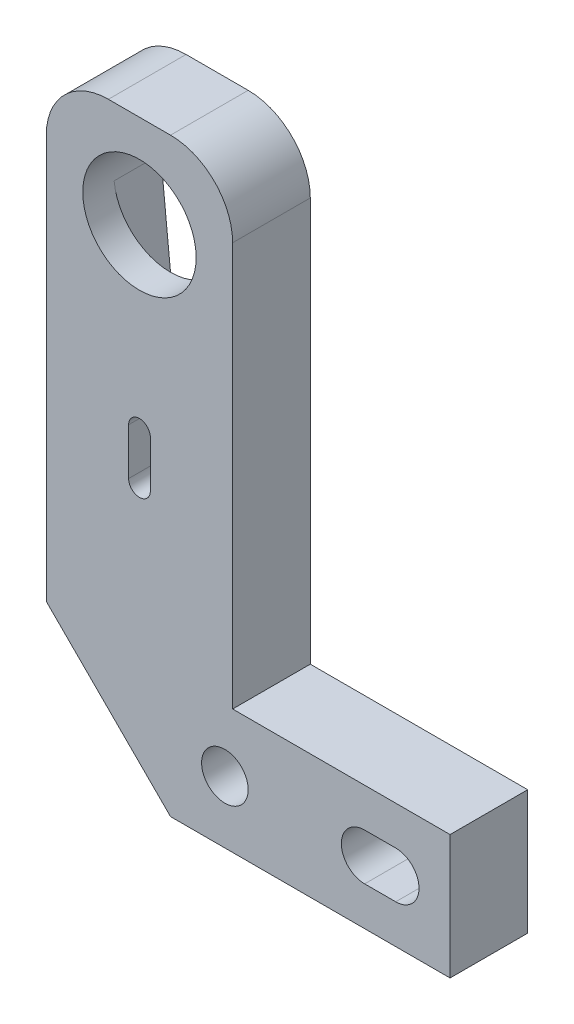
ISO-10303-21;
HEADER;
FILE_DESCRIPTION(('STEP AP214'),'2;1');
FILE_NAME('part.step','',(''),(''),'','','');
FILE_SCHEMA(('AUTOMOTIVE_DESIGN { 1 0 10303 214 1 1 1 1 }'));
ENDSEC;
DATA;
#1=APPLICATION_CONTEXT('core data for automotive mechanical design processes');
#2=APPLICATION_PROTOCOL_DEFINITION('international standard','automotive_design',2000,#1);
#3=PRODUCT_CONTEXT('',#1,'mechanical');
#4=PRODUCT('Part','Part','',(#3));
#5=PRODUCT_RELATED_PRODUCT_CATEGORY('part','',(#4));
#6=PRODUCT_DEFINITION_FORMATION('','',#4);
#7=PRODUCT_DEFINITION_CONTEXT('part definition',#1,'design');
#8=PRODUCT_DEFINITION('design','',#6,#7);
#9=PRODUCT_DEFINITION_SHAPE('','',#8);
#10=(LENGTH_UNIT() NAMED_UNIT(*) SI_UNIT(.MILLI.,.METRE.));
#11=(NAMED_UNIT(*) PLANE_ANGLE_UNIT() SI_UNIT($,.RADIAN.));
#12=(NAMED_UNIT(*) SI_UNIT($,.STERADIAN.) SOLID_ANGLE_UNIT());
#13=UNCERTAINTY_MEASURE_WITH_UNIT(LENGTH_MEASURE(1.E-05),#10,'distance_accuracy_value','');
#14=(GEOMETRIC_REPRESENTATION_CONTEXT(3) GLOBAL_UNCERTAINTY_ASSIGNED_CONTEXT((#13)) GLOBAL_UNIT_ASSIGNED_CONTEXT((#10,
#11,#12)) REPRESENTATION_CONTEXT('',''));
#15=CARTESIAN_POINT('',(0.,0.,0.));
#16=DIRECTION('',(0.,0.,1.));
#17=DIRECTION('',(1.,0.,0.));
#18=AXIS2_PLACEMENT_3D('',#15,#16,#17);
#19=CARTESIAN_POINT('',(0.,0.,5.));
#20=DIRECTION('',(0.,0.,-1.));
#21=DIRECTION('',(-1.,0.,0.));
#22=AXIS2_PLACEMENT_3D('',#19,#20,#21);
#23=CYLINDRICAL_SURFACE('',#22,3.65);
#24=CARTESIAN_POINT('',(0.,0.,5.));
#25=DIRECTION('',(0.,0.,1.));
#26=DIRECTION('',(1.,0.,0.));
#27=AXIS2_PLACEMENT_3D('',#24,#25,#26);
#28=CIRCLE('',#27,3.65);
#29=CARTESIAN_POINT('',(3.65,0.,5.));
#30=VERTEX_POINT('',#29);
#31=EDGE_CURVE('E363',#30,#30,#28,.T.);
#32=ORIENTED_EDGE('',*,*,#31,.T.);
#33=EDGE_LOOP('',(#32));
#34=FACE_BOUND('',#33,.T.);
#35=CARTESIAN_POINT('',(0.,0.,3.));
#36=DIRECTION('',(0.,0.,1.));
#37=DIRECTION('',(1.,0.,0.));
#38=AXIS2_PLACEMENT_3D('',#35,#36,#37);
#39=CIRCLE('',#38,3.65);
#40=CARTESIAN_POINT('',(-3.63170414543916,-0.365000000000001,3.));
#41=VERTEX_POINT('',#40);
#42=CARTESIAN_POINT('',(3.63170414543916,-0.365,3.));
#43=VERTEX_POINT('',#42);
#44=EDGE_CURVE('E389',#41,#43,#39,.T.);
#45=ORIENTED_EDGE('',*,*,#44,.F.);
#46=DIRECTION('',(0.,0.,-1.));
#47=VECTOR('',#46,1.);
#48=CARTESIAN_POINT('',(-3.63170414543916,-0.365000000000001,3.));
#49=LINE('',#48,#47);
#50=CARTESIAN_POINT('',(-3.63170414543916,-0.365000000000001,0.));
#51=VERTEX_POINT('',#50);
#52=EDGE_CURVE('E392',#41,#51,#49,.T.);
#53=ORIENTED_EDGE('',*,*,#52,.T.);
#54=CARTESIAN_POINT('',(0.,0.,0.));
#55=DIRECTION('',(0.,0.,1.));
#56=DIRECTION('',(1.,0.,0.));
#57=AXIS2_PLACEMENT_3D('',#54,#55,#56);
#58=CIRCLE('',#57,3.65);
#59=CARTESIAN_POINT('',(3.63170414543916,-0.365,0.));
#60=VERTEX_POINT('',#59);
#61=EDGE_CURVE('E249',#60,#51,#58,.T.);
#62=ORIENTED_EDGE('',*,*,#61,.F.);
#63=DIRECTION('',(0.,0.,-1.));
#64=VECTOR('',#63,1.);
#65=CARTESIAN_POINT('',(3.63170414543916,-0.365,3.));
#66=LINE('',#65,#64);
#67=EDGE_CURVE('E59',#43,#60,#66,.T.);
#68=ORIENTED_EDGE('',*,*,#67,.F.);
#69=EDGE_LOOP('',(#45,#53,#62,#68));
#70=FACE_BOUND('',#69,.T.);
#71=ADVANCED_FACE('F34',(#34,#70),#23,.F.);
#72=CARTESIAN_POINT('',(0.,0.,0.));
#73=DIRECTION('',(0.,0.,1.));
#74=DIRECTION('',(1.,0.,0.));
#75=AXIS2_PLACEMENT_3D('',#72,#73,#74);
#76=PLANE('',#75);
#77=CARTESIAN_POINT('',(5.5,-28.,0.));
#78=DIRECTION('',(0.,0.,1.));
#79=DIRECTION('',(1.,0.,0.));
#80=AXIS2_PLACEMENT_3D('',#77,#78,#79);
#81=CIRCLE('',#80,1.5);
#82=CARTESIAN_POINT('',(7.,-28.,0.));
#83=VERTEX_POINT('',#82);
#84=EDGE_CURVE('E252',#83,#83,#81,.T.);
#85=ORIENTED_EDGE('',*,*,#84,.T.);
#86=EDGE_LOOP('',(#85));
#87=FACE_BOUND('',#86,.T.);
#88=CARTESIAN_POINT('',(14.5,-28.,0.));
#89=DIRECTION('',(0.,0.,1.));
#90=DIRECTION('',(1.,0.,0.));
#91=AXIS2_PLACEMENT_3D('',#88,#89,#90);
#92=CIRCLE('',#91,1.5);
#93=CARTESIAN_POINT('',(14.5,-26.5,0.));
#94=VERTEX_POINT('',#93);
#95=CARTESIAN_POINT('',(14.5,-29.5,0.));
#96=VERTEX_POINT('',#95);
#97=EDGE_CURVE('E237',#94,#96,#92,.T.);
#98=ORIENTED_EDGE('',*,*,#97,.T.);
#99=DIRECTION('',(1.,0.,0.));
#100=VECTOR('',#99,1.);
#101=CARTESIAN_POINT('',(0.,-29.5,0.));
#102=LINE('',#101,#100);
#103=CARTESIAN_POINT('',(16.5,-29.5,0.));
#104=VERTEX_POINT('',#103);
#105=EDGE_CURVE('E246',#96,#104,#102,.T.);
#106=ORIENTED_EDGE('',*,*,#105,.T.);
#107=CARTESIAN_POINT('',(16.5,-28.,0.));
#108=DIRECTION('',(0.,0.,1.));
#109=DIRECTION('',(1.,0.,0.));
#110=AXIS2_PLACEMENT_3D('',#107,#108,#109);
#111=CIRCLE('',#110,1.5);
#112=CARTESIAN_POINT('',(16.5,-26.5,0.));
#113=VERTEX_POINT('',#112);
#114=EDGE_CURVE('E243',#104,#113,#111,.T.);
#115=ORIENTED_EDGE('',*,*,#114,.T.);
#116=DIRECTION('',(-1.,0.,0.));
#117=VECTOR('',#116,1.);
#118=CARTESIAN_POINT('',(0.,-26.5,0.));
#119=LINE('',#118,#117);
#120=EDGE_CURVE('E240',#113,#94,#119,.T.);
#121=ORIENTED_EDGE('',*,*,#120,.T.);
#122=EDGE_LOOP('',(#98,#106,#115,#121));
#123=FACE_BOUND('',#122,.T.);
#124=CARTESIAN_POINT('',(-2.,2.,0.));
#125=DIRECTION('',(0.,0.,1.));
#126=DIRECTION('',(1.,0.,0.));
#127=AXIS2_PLACEMENT_3D('',#124,#125,#126);
#128=CIRCLE('',#127,4.);
#129=CARTESIAN_POINT('',(-6.,2.,0.));
#130=VERTEX_POINT('',#129);
#131=CARTESIAN_POINT('',(-2.,6.,0.));
#132=VERTEX_POINT('',#131);
#133=EDGE_CURVE('E213',#130,#132,#128,.F.);
#134=ORIENTED_EDGE('',*,*,#133,.T.);
#135=DIRECTION('',(1.,0.,0.));
#136=VECTOR('',#135,1.);
#137=CARTESIAN_POINT('',(0.,6.,0.));
#138=LINE('',#137,#136);
#139=CARTESIAN_POINT('',(2.,6.,0.));
#140=VERTEX_POINT('',#139);
#141=EDGE_CURVE('E234',#132,#140,#138,.T.);
#142=ORIENTED_EDGE('',*,*,#141,.T.);
#143=CARTESIAN_POINT('',(2.,2.,0.));
#144=DIRECTION('',(0.,0.,1.));
#145=DIRECTION('',(1.,0.,0.));
#146=AXIS2_PLACEMENT_3D('',#143,#144,#145);
#147=CIRCLE('',#146,4.);
#148=CARTESIAN_POINT('',(6.,2.,0.));
#149=VERTEX_POINT('',#148);
#150=EDGE_CURVE('E231',#149,#140,#147,.T.);
#151=ORIENTED_EDGE('',*,*,#150,.F.);
#152=DIRECTION('',(0.,-1.,0.));
#153=VECTOR('',#152,1.);
#154=CARTESIAN_POINT('',(6.,0.,0.));
#155=LINE('',#154,#153);
#156=CARTESIAN_POINT('',(6.,-24.,0.));
#157=VERTEX_POINT('',#156);
#158=EDGE_CURVE('E228',#149,#157,#155,.T.);
#159=ORIENTED_EDGE('',*,*,#158,.T.);
#160=DIRECTION('',(-1.,0.,0.));
#161=VECTOR('',#160,1.);
#162=CARTESIAN_POINT('',(0.,-24.,0.));
#163=LINE('',#162,#161);
#164=CARTESIAN_POINT('',(20.,-24.,0.));
#165=VERTEX_POINT('',#164);
#166=EDGE_CURVE('E225',#165,#157,#163,.T.);
#167=ORIENTED_EDGE('',*,*,#166,.F.);
#168=DIRECTION('',(0.,1.,0.));
#169=VECTOR('',#168,1.);
#170=CARTESIAN_POINT('',(20.,0.,0.));
#171=LINE('',#170,#169);
#172=CARTESIAN_POINT('',(20.,-32.,0.));
#173=VERTEX_POINT('',#172);
#174=EDGE_CURVE('E223',#173,#165,#171,.T.);
#175=ORIENTED_EDGE('',*,*,#174,.F.);
#176=DIRECTION('',(1.,0.,0.));
#177=VECTOR('',#176,1.);
#178=CARTESIAN_POINT('',(0.,-32.,0.));
#179=LINE('',#178,#177);
#180=CARTESIAN_POINT('',(2.00000000000001,-32.,0.));
#181=VERTEX_POINT('',#180);
#182=EDGE_CURVE('E221',#181,#173,#179,.T.);
#183=ORIENTED_EDGE('',*,*,#182,.F.);
#184=DIRECTION('',(0.707106781186546,-0.707106781186549,0.));
#185=VECTOR('',#184,1.);
#186=CARTESIAN_POINT('',(-15.,-15.,0.));
#187=LINE('',#186,#185);
#188=CARTESIAN_POINT('',(-6.,-24.,0.));
#189=VERTEX_POINT('',#188);
#190=EDGE_CURVE('E219',#189,#181,#187,.T.);
#191=ORIENTED_EDGE('',*,*,#190,.F.);
#192=DIRECTION('',(0.,-1.,0.));
#193=VECTOR('',#192,1.);
#194=CARTESIAN_POINT('',(-6.,0.,0.));
#195=LINE('',#194,#193);
#196=EDGE_CURVE('E216',#130,#189,#195,.T.);
#197=ORIENTED_EDGE('',*,*,#196,.F.);
#198=EDGE_LOOP('',(#134,#142,#151,#159,#167,#175,#183,#191,#197));
#199=FACE_BOUND('',#198,.T.);
#200=DIRECTION('',(0.1,-0.99498743710662,0.));
#201=VECTOR('',#200,1.);
#202=CARTESIAN_POINT('',(-3.63170414543916,-0.365,0.));
#203=LINE('',#202,#201);
#204=CARTESIAN_POINT('',(-2.23872173348989,-14.225,0.));
#205=VERTEX_POINT('',#204);
#206=EDGE_CURVE('E393',#51,#205,#203,.T.);
#207=ORIENTED_EDGE('',*,*,#206,.T.);
#208=CARTESIAN_POINT('',(0.,-14.,0.));
#209=DIRECTION('',(0.,0.,1.));
#210=DIRECTION('',(1.,0.,0.));
#211=AXIS2_PLACEMENT_3D('',#208,#209,#210);
#212=CIRCLE('',#211,2.25);
#213=CARTESIAN_POINT('',(2.2387217334899,-14.225,0.));
#214=VERTEX_POINT('',#213);
#215=EDGE_CURVE('E396',#205,#214,#212,.T.);
#216=ORIENTED_EDGE('',*,*,#215,.T.);
#217=DIRECTION('',(0.0999999999999999,0.99498743710662,0.));
#218=VECTOR('',#217,1.);
#219=CARTESIAN_POINT('',(3.63170414543916,-0.364999999999999,0.));
#220=LINE('',#219,#218);
#221=EDGE_CURVE('E193',#214,#60,#220,.T.);
#222=ORIENTED_EDGE('',*,*,#221,.T.);
#223=ORIENTED_EDGE('',*,*,#61,.T.);
#224=EDGE_LOOP('',(#207,#216,#222,#223));
#225=FACE_BOUND('',#224,.T.);
#226=ADVANCED_FACE('F300',(#87,#123,#199,#225),#76,.F.);
#227=CARTESIAN_POINT('',(0.,-11.5,5.));
#228=DIRECTION('',(0.,0.,-1.));
#229=DIRECTION('',(-1.,0.,0.));
#230=AXIS2_PLACEMENT_3D('',#227,#228,#229);
#231=CYLINDRICAL_SURFACE('',#230,0.7);
#232=CARTESIAN_POINT('',(0.,-11.5,3.));
#233=DIRECTION('',(0.,0.,1.));
#234=DIRECTION('',(1.,0.,0.));
#235=AXIS2_PLACEMENT_3D('',#232,#233,#234);
#236=CIRCLE('',#235,0.7);
#237=CARTESIAN_POINT('',(0.7,-11.5,3.));
#238=VERTEX_POINT('',#237);
#239=CARTESIAN_POINT('',(-0.7,-11.5,3.));
#240=VERTEX_POINT('',#239);
#241=EDGE_CURVE('E51',#238,#240,#236,.T.);
#242=ORIENTED_EDGE('',*,*,#241,.F.);
#243=DIRECTION('',(0.,0.,-1.));
#244=VECTOR('',#243,1.);
#245=CARTESIAN_POINT('',(0.7,-11.5,5.));
#246=LINE('',#245,#244);
#247=CARTESIAN_POINT('',(0.7,-11.5,5.));
#248=VERTEX_POINT('',#247);
#249=EDGE_CURVE('E11',#248,#238,#246,.T.);
#250=ORIENTED_EDGE('',*,*,#249,.F.);
#251=CARTESIAN_POINT('',(0.,-11.5,5.));
#252=DIRECTION('',(0.,0.,1.));
#253=DIRECTION('',(1.,0.,0.));
#254=AXIS2_PLACEMENT_3D('',#251,#252,#253);
#255=CIRCLE('',#254,0.7);
#256=CARTESIAN_POINT('',(-0.7,-11.5,5.));
#257=VERTEX_POINT('',#256);
#258=EDGE_CURVE('E203',#248,#257,#255,.T.);
#259=ORIENTED_EDGE('',*,*,#258,.T.);
#260=DIRECTION('',(0.,0.,-1.));
#261=VECTOR('',#260,1.);
#262=CARTESIAN_POINT('',(-0.7,-11.5,5.));
#263=LINE('',#262,#261);
#264=EDGE_CURVE('E192',#257,#240,#263,.T.);
#265=ORIENTED_EDGE('',*,*,#264,.T.);
#266=EDGE_LOOP('',(#242,#250,#259,#265));
#267=FACE_BOUND('',#266,.T.);
#268=ADVANCED_FACE('F188',(#267),#231,.F.);
#269=CARTESIAN_POINT('',(0.699999999999998,0.,5.));
#270=DIRECTION('',(-1.,0.,0.));
#271=DIRECTION('',(0.,-1.,0.));
#272=AXIS2_PLACEMENT_3D('',#269,#270,#271);
#273=PLANE('',#272);
#274=DIRECTION('',(0.,1.,0.));
#275=VECTOR('',#274,1.);
#276=CARTESIAN_POINT('',(0.699999999999998,0.,3.));
#277=LINE('',#276,#275);
#278=CARTESIAN_POINT('',(0.700000000000001,-14.5,3.));
#279=VERTEX_POINT('',#278);
#280=EDGE_CURVE('E178',#279,#238,#277,.T.);
#281=ORIENTED_EDGE('',*,*,#280,.F.);
#282=DIRECTION('',(0.,0.,-1.));
#283=VECTOR('',#282,1.);
#284=CARTESIAN_POINT('',(0.700000000000001,-14.5,5.));
#285=LINE('',#284,#283);
#286=CARTESIAN_POINT('',(0.700000000000001,-14.5,5.));
#287=VERTEX_POINT('',#286);
#288=EDGE_CURVE('E43',#287,#279,#285,.T.);
#289=ORIENTED_EDGE('',*,*,#288,.F.);
#290=DIRECTION('',(0.,1.,0.));
#291=VECTOR('',#290,1.);
#292=CARTESIAN_POINT('',(0.699999999999998,0.,5.));
#293=LINE('',#292,#291);
#294=EDGE_CURVE('E198',#287,#248,#293,.T.);
#295=ORIENTED_EDGE('',*,*,#294,.T.);
#296=ORIENTED_EDGE('',*,*,#249,.T.);
#297=EDGE_LOOP('',(#281,#289,#295,#296));
#298=FACE_BOUND('',#297,.T.);
#299=ADVANCED_FACE('F196',(#298),#273,.T.);
#300=CARTESIAN_POINT('',(0.,-14.5,5.));
#301=DIRECTION('',(0.,0.,-1.));
#302=DIRECTION('',(-1.,0.,0.));
#303=AXIS2_PLACEMENT_3D('',#300,#301,#302);
#304=CYLINDRICAL_SURFACE('',#303,0.7);
#305=CARTESIAN_POINT('',(0.,-14.5,3.));
#306=DIRECTION('',(0.,0.,1.));
#307=DIRECTION('',(1.,0.,0.));
#308=AXIS2_PLACEMENT_3D('',#305,#306,#307);
#309=CIRCLE('',#308,0.7);
#310=CARTESIAN_POINT('',(-0.699999999999999,-14.5,3.));
#311=VERTEX_POINT('',#310);
#312=EDGE_CURVE('E182',#311,#279,#309,.T.);
#313=ORIENTED_EDGE('',*,*,#312,.F.);
#314=DIRECTION('',(0.,0.,-1.));
#315=VECTOR('',#314,1.);
#316=CARTESIAN_POINT('',(-0.699999999999999,-14.5,5.));
#317=LINE('',#316,#315);
#318=CARTESIAN_POINT('',(-0.699999999999999,-14.5,5.));
#319=VERTEX_POINT('',#318);
#320=EDGE_CURVE('E257',#319,#311,#317,.T.);
#321=ORIENTED_EDGE('',*,*,#320,.F.);
#322=CARTESIAN_POINT('',(0.,-14.5,5.));
#323=DIRECTION('',(0.,0.,1.));
#324=DIRECTION('',(1.,0.,0.));
#325=AXIS2_PLACEMENT_3D('',#322,#323,#324);
#326=CIRCLE('',#325,0.7);
#327=EDGE_CURVE('E202',#319,#287,#326,.T.);
#328=ORIENTED_EDGE('',*,*,#327,.T.);
#329=ORIENTED_EDGE('',*,*,#288,.T.);
#330=EDGE_LOOP('',(#313,#321,#328,#329));
#331=FACE_BOUND('',#330,.T.);
#332=ADVANCED_FACE('F451',(#331),#304,.F.);
#333=CARTESIAN_POINT('',(14.5,-28.,5.));
#334=DIRECTION('',(0.,0.,-1.));
#335=DIRECTION('',(-1.,0.,0.));
#336=AXIS2_PLACEMENT_3D('',#333,#334,#335);
#337=CYLINDRICAL_SURFACE('',#336,1.5);
#338=ORIENTED_EDGE('',*,*,#97,.F.);
#339=DIRECTION('',(0.,0.,-1.));
#340=VECTOR('',#339,1.);
#341=CARTESIAN_POINT('',(14.5,-26.5,5.));
#342=LINE('',#341,#340);
#343=CARTESIAN_POINT('',(14.5,-26.5,5.));
#344=VERTEX_POINT('',#343);
#345=EDGE_CURVE('E258',#344,#94,#342,.T.);
#346=ORIENTED_EDGE('',*,*,#345,.F.);
#347=CARTESIAN_POINT('',(14.5,-28.,5.));
#348=DIRECTION('',(0.,0.,1.));
#349=DIRECTION('',(1.,0.,0.));
#350=AXIS2_PLACEMENT_3D('',#347,#348,#349);
#351=CIRCLE('',#350,1.5);
#352=CARTESIAN_POINT('',(14.5,-29.5,5.));
#353=VERTEX_POINT('',#352);
#354=EDGE_CURVE('E351',#344,#353,#351,.T.);
#355=ORIENTED_EDGE('',*,*,#354,.T.);
#356=DIRECTION('',(0.,0.,-1.));
#357=VECTOR('',#356,1.);
#358=CARTESIAN_POINT('',(14.5,-29.5,5.));
#359=LINE('',#358,#357);
#360=EDGE_CURVE('E262',#353,#96,#359,.T.);
#361=ORIENTED_EDGE('',*,*,#360,.T.);
#362=EDGE_LOOP('',(#338,#346,#355,#361));
#363=FACE_BOUND('',#362,.T.);
#364=ADVANCED_FACE('F447',(#363),#337,.F.);
#365=CARTESIAN_POINT('',(0.,-26.5,5.));
#366=DIRECTION('',(0.,-1.,0.));
#367=DIRECTION('',(0.,0.,-1.));
#368=AXIS2_PLACEMENT_3D('',#365,#366,#367);
#369=PLANE('',#368);
#370=ORIENTED_EDGE('',*,*,#120,.F.);
#371=DIRECTION('',(0.,0.,-1.));
#372=VECTOR('',#371,1.);
#373=CARTESIAN_POINT('',(16.5,-26.5,5.));
#374=LINE('',#373,#372);
#375=CARTESIAN_POINT('',(16.5,-26.5,5.));
#376=VERTEX_POINT('',#375);
#377=EDGE_CURVE('E266',#376,#113,#374,.T.);
#378=ORIENTED_EDGE('',*,*,#377,.F.);
#379=DIRECTION('',(-1.,0.,0.));
#380=VECTOR('',#379,1.);
#381=CARTESIAN_POINT('',(0.,-26.5,5.));
#382=LINE('',#381,#380);
#383=EDGE_CURVE('E354',#376,#344,#382,.T.);
#384=ORIENTED_EDGE('',*,*,#383,.T.);
#385=ORIENTED_EDGE('',*,*,#345,.T.);
#386=EDGE_LOOP('',(#370,#378,#384,#385));
#387=FACE_BOUND('',#386,.T.);
#388=ADVANCED_FACE('F443',(#387),#369,.T.);
#389=CARTESIAN_POINT('',(16.5,-28.,5.));
#390=DIRECTION('',(0.,0.,-1.));
#391=DIRECTION('',(-1.,0.,0.));
#392=AXIS2_PLACEMENT_3D('',#389,#390,#391);
#393=CYLINDRICAL_SURFACE('',#392,1.5);
#394=ORIENTED_EDGE('',*,*,#114,.F.);
#395=DIRECTION('',(0.,0.,-1.));
#396=VECTOR('',#395,1.);
#397=CARTESIAN_POINT('',(16.5,-29.5,5.));
#398=LINE('',#397,#396);
#399=CARTESIAN_POINT('',(16.5,-29.5,5.));
#400=VERTEX_POINT('',#399);
#401=EDGE_CURVE('E264',#400,#104,#398,.T.);
#402=ORIENTED_EDGE('',*,*,#401,.F.);
#403=CARTESIAN_POINT('',(16.5,-28.,5.));
#404=DIRECTION('',(0.,0.,1.));
#405=DIRECTION('',(1.,0.,0.));
#406=AXIS2_PLACEMENT_3D('',#403,#404,#405);
#407=CIRCLE('',#406,1.5);
#408=EDGE_CURVE('E357',#400,#376,#407,.T.);
#409=ORIENTED_EDGE('',*,*,#408,.T.);
#410=ORIENTED_EDGE('',*,*,#377,.T.);
#411=EDGE_LOOP('',(#394,#402,#409,#410));
#412=FACE_BOUND('',#411,.T.);
#413=ADVANCED_FACE('F440',(#412),#393,.F.);
#414=CARTESIAN_POINT('',(-2.,2.,5.));
#415=DIRECTION('',(0.,0.,-1.));
#416=DIRECTION('',(-1.,0.,0.));
#417=AXIS2_PLACEMENT_3D('',#414,#415,#416);
#418=CYLINDRICAL_SURFACE('',#417,4.);
#419=ORIENTED_EDGE('',*,*,#133,.F.);
#420=DIRECTION('',(0.,0.,-1.));
#421=VECTOR('',#420,1.);
#422=CARTESIAN_POINT('',(-6.,2.,5.));
#423=LINE('',#422,#421);
#424=CARTESIAN_POINT('',(-6.,2.,5.));
#425=VERTEX_POINT('',#424);
#426=EDGE_CURVE('E38',#425,#130,#423,.T.);
#427=ORIENTED_EDGE('',*,*,#426,.F.);
#428=CARTESIAN_POINT('',(-2.,2.,5.));
#429=DIRECTION('',(0.,0.,1.));
#430=DIRECTION('',(1.,0.,0.));
#431=AXIS2_PLACEMENT_3D('',#428,#429,#430);
#432=CIRCLE('',#431,4.);
#433=CARTESIAN_POINT('',(-2.,6.,5.));
#434=VERTEX_POINT('',#433);
#435=EDGE_CURVE('E255',#425,#434,#432,.F.);
#436=ORIENTED_EDGE('',*,*,#435,.T.);
#437=DIRECTION('',(0.,0.,-1.));
#438=VECTOR('',#437,1.);
#439=CARTESIAN_POINT('',(-2.,6.,5.));
#440=LINE('',#439,#438);
#441=EDGE_CURVE('E212',#434,#132,#440,.T.);
#442=ORIENTED_EDGE('',*,*,#441,.T.);
#443=EDGE_LOOP('',(#419,#427,#436,#442));
#444=FACE_BOUND('',#443,.T.);
#445=ADVANCED_FACE('F36',(#444),#418,.T.);
#446=CARTESIAN_POINT('',(-6.,0.,5.));
#447=DIRECTION('',(1.,0.,0.));
#448=DIRECTION('',(0.,1.,0.));
#449=AXIS2_PLACEMENT_3D('',#446,#447,#448);
#450=PLANE('',#449);
#451=ORIENTED_EDGE('',*,*,#196,.T.);
#452=DIRECTION('',(0.,0.,-1.));
#453=VECTOR('',#452,1.);
#454=CARTESIAN_POINT('',(-6.,-24.,5.));
#455=LINE('',#454,#453);
#456=CARTESIAN_POINT('',(-6.,-24.,5.));
#457=VERTEX_POINT('',#456);
#458=EDGE_CURVE('E284',#457,#189,#455,.T.);
#459=ORIENTED_EDGE('',*,*,#458,.F.);
#460=DIRECTION('',(0.,-1.,0.));
#461=VECTOR('',#460,1.);
#462=CARTESIAN_POINT('',(-6.,0.,5.));
#463=LINE('',#462,#461);
#464=EDGE_CURVE('E294',#425,#457,#463,.T.);
#465=ORIENTED_EDGE('',*,*,#464,.F.);
#466=ORIENTED_EDGE('',*,*,#426,.T.);
#467=EDGE_LOOP('',(#451,#459,#465,#466));
#468=FACE_BOUND('',#467,.T.);
#469=ADVANCED_FACE('F293',(#468),#450,.F.);
#470=CARTESIAN_POINT('',(-15.,-15.,5.));
#471=DIRECTION('',(0.707106781186549,0.707106781186546,0.));
#472=DIRECTION('',(-0.707106781186546,0.707106781186549,0.));
#473=AXIS2_PLACEMENT_3D('',#470,#471,#472);
#474=PLANE('',#473);
#475=ORIENTED_EDGE('',*,*,#190,.T.);
#476=DIRECTION('',(0.,0.,-1.));
#477=VECTOR('',#476,1.);
#478=CARTESIAN_POINT('',(2.00000000000001,-32.,5.));
#479=LINE('',#478,#477);
#480=CARTESIAN_POINT('',(2.00000000000001,-32.,5.));
#481=VERTEX_POINT('',#480);
#482=EDGE_CURVE('E282',#481,#181,#479,.T.);
#483=ORIENTED_EDGE('',*,*,#482,.F.);
#484=DIRECTION('',(0.707106781186546,-0.707106781186549,0.));
#485=VECTOR('',#484,1.);
#486=CARTESIAN_POINT('',(-15.,-15.,5.));
#487=LINE('',#486,#485);
#488=EDGE_CURVE('E337',#457,#481,#487,.T.);
#489=ORIENTED_EDGE('',*,*,#488,.F.);
#490=ORIENTED_EDGE('',*,*,#458,.T.);
#491=EDGE_LOOP('',(#475,#483,#489,#490));
#492=FACE_BOUND('',#491,.T.);
#493=ADVANCED_FACE('F336',(#492),#474,.F.);
#494=CARTESIAN_POINT('',(0.,-32.,5.));
#495=DIRECTION('',(0.,1.,0.));
#496=DIRECTION('',(0.,0.,1.));
#497=AXIS2_PLACEMENT_3D('',#494,#495,#496);
#498=PLANE('',#497);
#499=ORIENTED_EDGE('',*,*,#182,.T.);
#500=DIRECTION('',(0.,0.,-1.));
#501=VECTOR('',#500,1.);
#502=CARTESIAN_POINT('',(20.,-32.,5.));
#503=LINE('',#502,#501);
#504=CARTESIAN_POINT('',(20.,-32.,5.));
#505=VERTEX_POINT('',#504);
#506=EDGE_CURVE('E279',#505,#173,#503,.T.);
#507=ORIENTED_EDGE('',*,*,#506,.F.);
#508=DIRECTION('',(1.,0.,0.));
#509=VECTOR('',#508,1.);
#510=CARTESIAN_POINT('',(0.,-32.,5.));
#511=LINE('',#510,#509);
#512=EDGE_CURVE('E334',#481,#505,#511,.T.);
#513=ORIENTED_EDGE('',*,*,#512,.F.);
#514=ORIENTED_EDGE('',*,*,#482,.T.);
#515=EDGE_LOOP('',(#499,#507,#513,#514));
#516=FACE_BOUND('',#515,.T.);
#517=ADVANCED_FACE('F333',(#516),#498,.F.);
#518=CARTESIAN_POINT('',(20.,0.,5.));
#519=DIRECTION('',(-1.,0.,0.));
#520=DIRECTION('',(0.,0.,1.));
#521=AXIS2_PLACEMENT_3D('',#518,#519,#520);
#522=PLANE('',#521);
#523=ORIENTED_EDGE('',*,*,#174,.T.);
#524=DIRECTION('',(0.,0.,-1.));
#525=VECTOR('',#524,1.);
#526=CARTESIAN_POINT('',(20.,-24.,5.));
#527=LINE('',#526,#525);
#528=CARTESIAN_POINT('',(20.,-24.,5.));
#529=VERTEX_POINT('',#528);
#530=EDGE_CURVE('E276',#529,#165,#527,.T.);
#531=ORIENTED_EDGE('',*,*,#530,.F.);
#532=DIRECTION('',(0.,1.,0.));
#533=VECTOR('',#532,1.);
#534=CARTESIAN_POINT('',(20.,0.,5.));
#535=LINE('',#534,#533);
#536=EDGE_CURVE('E330',#505,#529,#535,.T.);
#537=ORIENTED_EDGE('',*,*,#536,.F.);
#538=ORIENTED_EDGE('',*,*,#506,.T.);
#539=EDGE_LOOP('',(#523,#531,#537,#538));
#540=FACE_BOUND('',#539,.T.);
#541=ADVANCED_FACE('F327',(#540),#522,.F.);
#542=CARTESIAN_POINT('',(0.,-24.,5.));
#543=DIRECTION('',(0.,-1.,0.));
#544=DIRECTION('',(1.,0.,0.));
#545=AXIS2_PLACEMENT_3D('',#542,#543,#544);
#546=PLANE('',#545);
#547=ORIENTED_EDGE('',*,*,#166,.T.);
#548=DIRECTION('',(0.,0.,-1.));
#549=VECTOR('',#548,1.);
#550=CARTESIAN_POINT('',(6.,-24.,5.));
#551=LINE('',#550,#549);
#552=CARTESIAN_POINT('',(6.,-24.,5.));
#553=VERTEX_POINT('',#552);
#554=EDGE_CURVE('E274',#553,#157,#551,.T.);
#555=ORIENTED_EDGE('',*,*,#554,.F.);
#556=DIRECTION('',(-1.,0.,0.));
#557=VECTOR('',#556,1.);
#558=CARTESIAN_POINT('',(0.,-24.,5.));
#559=LINE('',#558,#557);
#560=EDGE_CURVE('E345',#529,#553,#559,.T.);
#561=ORIENTED_EDGE('',*,*,#560,.F.);
#562=ORIENTED_EDGE('',*,*,#530,.T.);
#563=EDGE_LOOP('',(#547,#555,#561,#562));
#564=FACE_BOUND('',#563,.T.);
#565=ADVANCED_FACE('F323',(#564),#546,.F.);
#566=CARTESIAN_POINT('',(6.,0.,5.));
#567=DIRECTION('',(1.,0.,0.));
#568=DIRECTION('',(0.,1.,0.));
#569=AXIS2_PLACEMENT_3D('',#566,#567,#568);
#570=PLANE('',#569);
#571=ORIENTED_EDGE('',*,*,#158,.F.);
#572=DIRECTION('',(0.,0.,-1.));
#573=VECTOR('',#572,1.);
#574=CARTESIAN_POINT('',(6.,2.,5.));
#575=LINE('',#574,#573);
#576=CARTESIAN_POINT('',(6.,2.,5.));
#577=VERTEX_POINT('',#576);
#578=EDGE_CURVE('E272',#577,#149,#575,.T.);
#579=ORIENTED_EDGE('',*,*,#578,.F.);
#580=DIRECTION('',(0.,-1.,0.));
#581=VECTOR('',#580,1.);
#582=CARTESIAN_POINT('',(6.,0.,5.));
#583=LINE('',#582,#581);
#584=EDGE_CURVE('E320',#577,#553,#583,.T.);
#585=ORIENTED_EDGE('',*,*,#584,.T.);
#586=ORIENTED_EDGE('',*,*,#554,.T.);
#587=EDGE_LOOP('',(#571,#579,#585,#586));
#588=FACE_BOUND('',#587,.T.);
#589=ADVANCED_FACE('F315',(#588),#570,.T.);
#590=CARTESIAN_POINT('',(2.,2.,5.));
#591=DIRECTION('',(0.,0.,-1.));
#592=DIRECTION('',(-1.,0.,0.));
#593=AXIS2_PLACEMENT_3D('',#590,#591,#592);
#594=CYLINDRICAL_SURFACE('',#593,4.);
#595=ORIENTED_EDGE('',*,*,#150,.T.);
#596=DIRECTION('',(0.,0.,-1.));
#597=VECTOR('',#596,1.);
#598=CARTESIAN_POINT('',(2.,6.,5.));
#599=LINE('',#598,#597);
#600=CARTESIAN_POINT('',(2.,6.,5.));
#601=VERTEX_POINT('',#600);
#602=EDGE_CURVE('E270',#601,#140,#599,.T.);
#603=ORIENTED_EDGE('',*,*,#602,.F.);
#604=CARTESIAN_POINT('',(2.,2.,5.));
#605=DIRECTION('',(0.,0.,1.));
#606=DIRECTION('',(1.,0.,0.));
#607=AXIS2_PLACEMENT_3D('',#604,#605,#606);
#608=CIRCLE('',#607,4.);
#609=EDGE_CURVE('E348',#577,#601,#608,.T.);
#610=ORIENTED_EDGE('',*,*,#609,.F.);
#611=ORIENTED_EDGE('',*,*,#578,.T.);
#612=EDGE_LOOP('',(#595,#603,#610,#611));
#613=FACE_BOUND('',#612,.T.);
#614=ADVANCED_FACE('F455',(#613),#594,.T.);
#615=CARTESIAN_POINT('',(5.5,-28.,5.));
#616=DIRECTION('',(0.,0.,-1.));
#617=DIRECTION('',(-1.,0.,0.));
#618=AXIS2_PLACEMENT_3D('',#615,#616,#617);
#619=CYLINDRICAL_SURFACE('',#618,1.5);
#620=CARTESIAN_POINT('',(5.5,-28.,5.));
#621=DIRECTION('',(0.,0.,1.));
#622=DIRECTION('',(1.,0.,0.));
#623=AXIS2_PLACEMENT_3D('',#620,#621,#622);
#624=CIRCLE('',#623,1.5);
#625=CARTESIAN_POINT('',(7.,-28.,5.));
#626=VERTEX_POINT('',#625);
#627=EDGE_CURVE('E207',#626,#626,#624,.T.);
#628=ORIENTED_EDGE('',*,*,#627,.T.);
#629=EDGE_LOOP('',(#628));
#630=FACE_BOUND('',#629,.T.);
#631=ORIENTED_EDGE('',*,*,#84,.F.);
#632=EDGE_LOOP('',(#631));
#633=FACE_BOUND('',#632,.T.);
#634=ADVANCED_FACE('F368',(#630,#633),#619,.F.);
#635=CARTESIAN_POINT('',(0.,-29.5,5.));
#636=DIRECTION('',(0.,1.,0.));
#637=DIRECTION('',(0.,0.,1.));
#638=AXIS2_PLACEMENT_3D('',#635,#636,#637);
#639=PLANE('',#638);
#640=ORIENTED_EDGE('',*,*,#105,.F.);
#641=ORIENTED_EDGE('',*,*,#360,.F.);
#642=DIRECTION('',(1.,0.,0.));
#643=VECTOR('',#642,1.);
#644=CARTESIAN_POINT('',(0.,-29.5,5.));
#645=LINE('',#644,#643);
#646=EDGE_CURVE('E360',#353,#400,#645,.T.);
#647=ORIENTED_EDGE('',*,*,#646,.T.);
#648=ORIENTED_EDGE('',*,*,#401,.T.);
#649=EDGE_LOOP('',(#640,#641,#647,#648));
#650=FACE_BOUND('',#649,.T.);
#651=ADVANCED_FACE('F436',(#650),#639,.T.);
#652=CARTESIAN_POINT('',(0.,6.,5.));
#653=DIRECTION('',(0.,1.,0.));
#654=DIRECTION('',(0.,0.,1.));
#655=AXIS2_PLACEMENT_3D('',#652,#653,#654);
#656=PLANE('',#655);
#657=ORIENTED_EDGE('',*,*,#141,.F.);
#658=ORIENTED_EDGE('',*,*,#441,.F.);
#659=DIRECTION('',(1.,0.,0.));
#660=VECTOR('',#659,1.);
#661=CARTESIAN_POINT('',(0.,6.,5.));
#662=LINE('',#661,#660);
#663=EDGE_CURVE('E308',#434,#601,#662,.T.);
#664=ORIENTED_EDGE('',*,*,#663,.T.);
#665=ORIENTED_EDGE('',*,*,#602,.T.);
#666=EDGE_LOOP('',(#657,#658,#664,#665));
#667=FACE_BOUND('',#666,.T.);
#668=ADVANCED_FACE('F307',(#667),#656,.T.);
#669=CARTESIAN_POINT('',(-0.700000000000002,0.,5.));
#670=DIRECTION('',(-1.,0.,0.));
#671=DIRECTION('',(0.,-1.,0.));
#672=AXIS2_PLACEMENT_3D('',#669,#670,#671);
#673=PLANE('',#672);
#674=ORIENTED_EDGE('',*,*,#320,.T.);
#675=DIRECTION('',(0.,1.,0.));
#676=VECTOR('',#675,1.);
#677=CARTESIAN_POINT('',(-0.700000000000002,0.,3.));
#678=LINE('',#677,#676);
#679=EDGE_CURVE('E378',#311,#240,#678,.T.);
#680=ORIENTED_EDGE('',*,*,#679,.T.);
#681=ORIENTED_EDGE('',*,*,#264,.F.);
#682=DIRECTION('',(0.,1.,0.));
#683=VECTOR('',#682,1.);
#684=CARTESIAN_POINT('',(-0.700000000000002,0.,5.));
#685=LINE('',#684,#683);
#686=EDGE_CURVE('E205',#319,#257,#685,.T.);
#687=ORIENTED_EDGE('',*,*,#686,.F.);
#688=EDGE_LOOP('',(#674,#680,#681,#687));
#689=FACE_BOUND('',#688,.T.);
#690=ADVANCED_FACE('F374',(#689),#673,.F.);
#691=CARTESIAN_POINT('',(0.,0.,5.));
#692=DIRECTION('',(0.,0.,1.));
#693=DIRECTION('',(1.,0.,0.));
#694=AXIS2_PLACEMENT_3D('',#691,#692,#693);
#695=PLANE('',#694);
#696=ORIENTED_EDGE('',*,*,#435,.F.);
#697=ORIENTED_EDGE('',*,*,#464,.T.);
#698=ORIENTED_EDGE('',*,*,#488,.T.);
#699=ORIENTED_EDGE('',*,*,#512,.T.);
#700=ORIENTED_EDGE('',*,*,#536,.T.);
#701=ORIENTED_EDGE('',*,*,#560,.T.);
#702=ORIENTED_EDGE('',*,*,#584,.F.);
#703=ORIENTED_EDGE('',*,*,#609,.T.);
#704=ORIENTED_EDGE('',*,*,#663,.F.);
#705=EDGE_LOOP('',(#696,#697,#698,#699,#700,#701,#702,#703,#704));
#706=FACE_BOUND('',#705,.T.);
#707=ORIENTED_EDGE('',*,*,#354,.F.);
#708=ORIENTED_EDGE('',*,*,#383,.F.);
#709=ORIENTED_EDGE('',*,*,#408,.F.);
#710=ORIENTED_EDGE('',*,*,#646,.F.);
#711=EDGE_LOOP('',(#707,#708,#709,#710));
#712=FACE_BOUND('',#711,.T.);
#713=ORIENTED_EDGE('',*,*,#31,.F.);
#714=EDGE_LOOP('',(#713));
#715=FACE_BOUND('',#714,.T.);
#716=ORIENTED_EDGE('',*,*,#627,.F.);
#717=EDGE_LOOP('',(#716));
#718=FACE_BOUND('',#717,.T.);
#719=ORIENTED_EDGE('',*,*,#258,.F.);
#720=ORIENTED_EDGE('',*,*,#294,.F.);
#721=ORIENTED_EDGE('',*,*,#327,.F.);
#722=ORIENTED_EDGE('',*,*,#686,.T.);
#723=EDGE_LOOP('',(#719,#720,#721,#722));
#724=FACE_BOUND('',#723,.T.);
#725=ADVANCED_FACE('F371',(#706,#712,#715,#718,#724),#695,.T.);
#726=CARTESIAN_POINT('',(-3.63170414543916,-0.365,3.));
#727=DIRECTION('',(0.99498743710662,0.1,0.));
#728=DIRECTION('',(-0.1,0.99498743710662,0.));
#729=AXIS2_PLACEMENT_3D('',#726,#727,#728);
#730=PLANE('',#729);
#731=ORIENTED_EDGE('',*,*,#206,.F.);
#732=ORIENTED_EDGE('',*,*,#52,.F.);
#733=DIRECTION('',(0.1,-0.99498743710662,0.));
#734=VECTOR('',#733,1.);
#735=CARTESIAN_POINT('',(-3.63170414543916,-0.365,3.));
#736=LINE('',#735,#734);
#737=CARTESIAN_POINT('',(-2.23872173348989,-14.225,3.));
#738=VERTEX_POINT('',#737);
#739=EDGE_CURVE('E379',#41,#738,#736,.T.);
#740=ORIENTED_EDGE('',*,*,#739,.T.);
#741=DIRECTION('',(0.,0.,-1.));
#742=VECTOR('',#741,1.);
#743=CARTESIAN_POINT('',(-2.23872173348989,-14.225,3.));
#744=LINE('',#743,#742);
#745=EDGE_CURVE('E217',#738,#205,#744,.T.);
#746=ORIENTED_EDGE('',*,*,#745,.T.);
#747=EDGE_LOOP('',(#731,#732,#740,#746));
#748=FACE_BOUND('',#747,.T.);
#749=ADVANCED_FACE('F373',(#748),#730,.T.);
#750=CARTESIAN_POINT('',(0.,-14.,3.));
#751=DIRECTION('',(0.,0.,-1.));
#752=DIRECTION('',(-1.,0.,0.));
#753=AXIS2_PLACEMENT_3D('',#750,#751,#752);
#754=CYLINDRICAL_SURFACE('',#753,2.25);
#755=ORIENTED_EDGE('',*,*,#215,.F.);
#756=ORIENTED_EDGE('',*,*,#745,.F.);
#757=CARTESIAN_POINT('',(0.,-14.,3.));
#758=DIRECTION('',(0.,0.,1.));
#759=DIRECTION('',(1.,0.,0.));
#760=AXIS2_PLACEMENT_3D('',#757,#758,#759);
#761=CIRCLE('',#760,2.25);
#762=CARTESIAN_POINT('',(2.2387217334899,-14.225,3.));
#763=VERTEX_POINT('',#762);
#764=EDGE_CURVE('E382',#738,#763,#761,.T.);
#765=ORIENTED_EDGE('',*,*,#764,.T.);
#766=DIRECTION('',(0.,0.,-1.));
#767=VECTOR('',#766,1.);
#768=CARTESIAN_POINT('',(2.2387217334899,-14.225,3.));
#769=LINE('',#768,#767);
#770=EDGE_CURVE('E403',#763,#214,#769,.T.);
#771=ORIENTED_EDGE('',*,*,#770,.T.);
#772=EDGE_LOOP('',(#755,#756,#765,#771));
#773=FACE_BOUND('',#772,.T.);
#774=ADVANCED_FACE('F415',(#773),#754,.F.);
#775=CARTESIAN_POINT('',(3.63170414543916,-0.364999999999999,3.));
#776=DIRECTION('',(-0.99498743710662,0.0999999999999998,0.));
#777=DIRECTION('',(-0.0999999999999998,-0.99498743710662,0.));
#778=AXIS2_PLACEMENT_3D('',#775,#776,#777);
#779=PLANE('',#778);
#780=ORIENTED_EDGE('',*,*,#221,.F.);
#781=ORIENTED_EDGE('',*,*,#770,.F.);
#782=DIRECTION('',(0.0999999999999999,0.99498743710662,0.));
#783=VECTOR('',#782,1.);
#784=CARTESIAN_POINT('',(3.63170414543916,-0.364999999999999,3.));
#785=LINE('',#784,#783);
#786=EDGE_CURVE('E387',#763,#43,#785,.T.);
#787=ORIENTED_EDGE('',*,*,#786,.T.);
#788=ORIENTED_EDGE('',*,*,#67,.T.);
#789=EDGE_LOOP('',(#780,#781,#787,#788));
#790=FACE_BOUND('',#789,.T.);
#791=ADVANCED_FACE('F416',(#790),#779,.T.);
#792=CARTESIAN_POINT('',(0.,0.,3.));
#793=DIRECTION('',(0.,0.,1.));
#794=DIRECTION('',(1.,0.,0.));
#795=AXIS2_PLACEMENT_3D('',#792,#793,#794);
#796=PLANE('',#795);
#797=ORIENTED_EDGE('',*,*,#241,.T.);
#798=ORIENTED_EDGE('',*,*,#679,.F.);
#799=ORIENTED_EDGE('',*,*,#312,.T.);
#800=ORIENTED_EDGE('',*,*,#280,.T.);
#801=EDGE_LOOP('',(#797,#798,#799,#800));
#802=FACE_BOUND('',#801,.T.);
#803=ORIENTED_EDGE('',*,*,#739,.F.);
#804=ORIENTED_EDGE('',*,*,#44,.T.);
#805=ORIENTED_EDGE('',*,*,#786,.F.);
#806=ORIENTED_EDGE('',*,*,#764,.F.);
#807=EDGE_LOOP('',(#803,#804,#805,#806));
#808=FACE_BOUND('',#807,.T.);
#809=ADVANCED_FACE('F179',(#802,#808),#796,.F.);
#810=CLOSED_SHELL('',(#71,#226,#268,#299,#332,#364,#388,#413,#445,#469,#493,#517,#541,#565,#589,
#614,#634,#651,#668,#690,#725,#749,#774,#791,#809));
#811=MANIFOLD_SOLID_BREP('B2',#810);
#812=ADVANCED_BREP_SHAPE_REPRESENTATION('',(#18,#811),#14);
#813=SHAPE_DEFINITION_REPRESENTATION(#9,#812);
ENDSEC;
END-ISO-10303-21;
